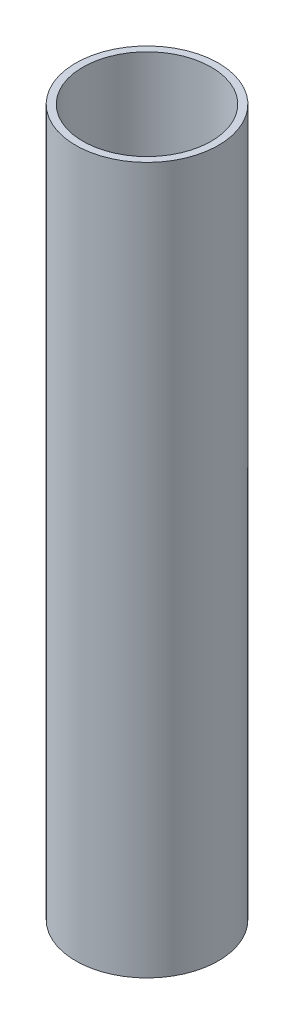
ISO-10303-21;
HEADER;
FILE_DESCRIPTION(('STEP AP214'),'2;1');
FILE_NAME('part.step','',(''),(''),'','','');
FILE_SCHEMA(('AUTOMOTIVE_DESIGN { 1 0 10303 214 1 1 1 1 }'));
ENDSEC;
DATA;
#1=APPLICATION_CONTEXT('core data for automotive mechanical design processes');
#2=APPLICATION_PROTOCOL_DEFINITION('international standard','automotive_design',2000,#1);
#3=PRODUCT_CONTEXT('',#1,'mechanical');
#4=PRODUCT('Part','Part','',(#3));
#5=PRODUCT_RELATED_PRODUCT_CATEGORY('part','',(#4));
#6=PRODUCT_DEFINITION_FORMATION('','',#4);
#7=PRODUCT_DEFINITION_CONTEXT('part definition',#1,'design');
#8=PRODUCT_DEFINITION('design','',#6,#7);
#9=PRODUCT_DEFINITION_SHAPE('','',#8);
#10=(LENGTH_UNIT() NAMED_UNIT(*) SI_UNIT(.MILLI.,.METRE.));
#11=(NAMED_UNIT(*) PLANE_ANGLE_UNIT() SI_UNIT($,.RADIAN.));
#12=(NAMED_UNIT(*) SI_UNIT($,.STERADIAN.) SOLID_ANGLE_UNIT());
#13=UNCERTAINTY_MEASURE_WITH_UNIT(LENGTH_MEASURE(1.E-05),#10,'distance_accuracy_value','');
#14=(GEOMETRIC_REPRESENTATION_CONTEXT(3) GLOBAL_UNCERTAINTY_ASSIGNED_CONTEXT((#13)) GLOBAL_UNIT_ASSIGNED_CONTEXT((#10,
#11,#12)) REPRESENTATION_CONTEXT('',''));
#15=CARTESIAN_POINT('',(0.,0.,0.));
#16=DIRECTION('',(0.,0.,1.));
#17=DIRECTION('',(1.,0.,0.));
#18=AXIS2_PLACEMENT_3D('',#15,#16,#17);
#19=CARTESIAN_POINT('',(0.,0.,0.));
#20=DIRECTION('',(0.,-1.,0.));
#21=DIRECTION('',(0.,0.,-1.));
#22=AXIS2_PLACEMENT_3D('',#19,#20,#21);
#23=CYLINDRICAL_SURFACE('',#22,114.3);
#24=CARTESIAN_POINT('',(0.,3035.3,0.));
#25=DIRECTION('',(0.,-1.,0.));
#26=DIRECTION('',(0.,0.,-1.));
#27=AXIS2_PLACEMENT_3D('',#24,#25,#26);
#28=CIRCLE('',#27,114.3);
#29=CARTESIAN_POINT('',(0.,3035.3,-114.3));
#30=VERTEX_POINT('',#29);
#31=EDGE_CURVE('E49',#30,#30,#28,.T.);
#32=ORIENTED_EDGE('',*,*,#31,.F.);
#33=EDGE_LOOP('',(#32));
#34=FACE_BOUND('',#33,.T.);
#35=CARTESIAN_POINT('',(0.,1778.,0.));
#36=DIRECTION('',(0.,-1.,0.));
#37=DIRECTION('',(0.,0.,-1.));
#38=AXIS2_PLACEMENT_3D('',#35,#36,#37);
#39=CIRCLE('',#38,114.3);
#40=CARTESIAN_POINT('',(0.,1778.,-114.3));
#41=VERTEX_POINT('',#40);
#42=EDGE_CURVE('E10',#41,#41,#39,.T.);
#43=ORIENTED_EDGE('',*,*,#42,.T.);
#44=EDGE_LOOP('',(#43));
#45=FACE_BOUND('',#44,.T.);
#46=ADVANCED_FACE('F35',(#34,#45),#23,.F.);
#47=CARTESIAN_POINT('',(0.,1778.,0.));
#48=DIRECTION('',(0.,-1.,0.));
#49=DIRECTION('',(0.,0.,-1.));
#50=AXIS2_PLACEMENT_3D('',#47,#48,#49);
#51=PLANE('',#50);
#52=CARTESIAN_POINT('',(0.,1778.,0.));
#53=DIRECTION('',(0.,-1.,0.));
#54=DIRECTION('',(0.,0.,-1.));
#55=AXIS2_PLACEMENT_3D('',#52,#53,#54);
#56=CIRCLE('',#55,127.);
#57=CARTESIAN_POINT('',(0.,1778.,-127.));
#58=VERTEX_POINT('',#57);
#59=EDGE_CURVE('E41',#58,#58,#56,.T.);
#60=ORIENTED_EDGE('',*,*,#59,.T.);
#61=EDGE_LOOP('',(#60));
#62=FACE_BOUND('',#61,.T.);
#63=ORIENTED_EDGE('',*,*,#42,.F.);
#64=EDGE_LOOP('',(#63));
#65=FACE_BOUND('',#64,.T.);
#66=ADVANCED_FACE('F58',(#62,#65),#51,.T.);
#67=CARTESIAN_POINT('',(0.,0.,0.));
#68=DIRECTION('',(0.,-1.,0.));
#69=DIRECTION('',(0.,0.,-1.));
#70=AXIS2_PLACEMENT_3D('',#67,#68,#69);
#71=CYLINDRICAL_SURFACE('',#70,127.);
#72=ORIENTED_EDGE('',*,*,#59,.F.);
#73=EDGE_LOOP('',(#72));
#74=FACE_BOUND('',#73,.T.);
#75=CARTESIAN_POINT('',(0.,3035.3,0.));
#76=DIRECTION('',(0.,-1.,0.));
#77=DIRECTION('',(0.,0.,-1.));
#78=AXIS2_PLACEMENT_3D('',#75,#76,#77);
#79=CIRCLE('',#78,127.);
#80=CARTESIAN_POINT('',(0.,3035.3,-127.));
#81=VERTEX_POINT('',#80);
#82=EDGE_CURVE('E45',#81,#81,#79,.T.);
#83=ORIENTED_EDGE('',*,*,#82,.T.);
#84=EDGE_LOOP('',(#83));
#85=FACE_BOUND('',#84,.T.);
#86=ADVANCED_FACE('F62',(#74,#85),#71,.T.);
#87=CARTESIAN_POINT('',(0.,3035.3,0.));
#88=DIRECTION('',(0.,-1.,0.));
#89=DIRECTION('',(0.,0.,-1.));
#90=AXIS2_PLACEMENT_3D('',#87,#88,#89);
#91=PLANE('',#90);
#92=ORIENTED_EDGE('',*,*,#82,.F.);
#93=EDGE_LOOP('',(#92));
#94=FACE_BOUND('',#93,.T.);
#95=ORIENTED_EDGE('',*,*,#31,.T.);
#96=EDGE_LOOP('',(#95));
#97=FACE_BOUND('',#96,.T.);
#98=ADVANCED_FACE('F55',(#94,#97),#91,.F.);
#99=CLOSED_SHELL('',(#46,#66,#86,#98));
#100=MANIFOLD_SOLID_BREP('B2',#99);
#101=ADVANCED_BREP_SHAPE_REPRESENTATION('',(#18,#100),#14);
#102=SHAPE_DEFINITION_REPRESENTATION(#9,#101);
ENDSEC;
END-ISO-10303-21;
